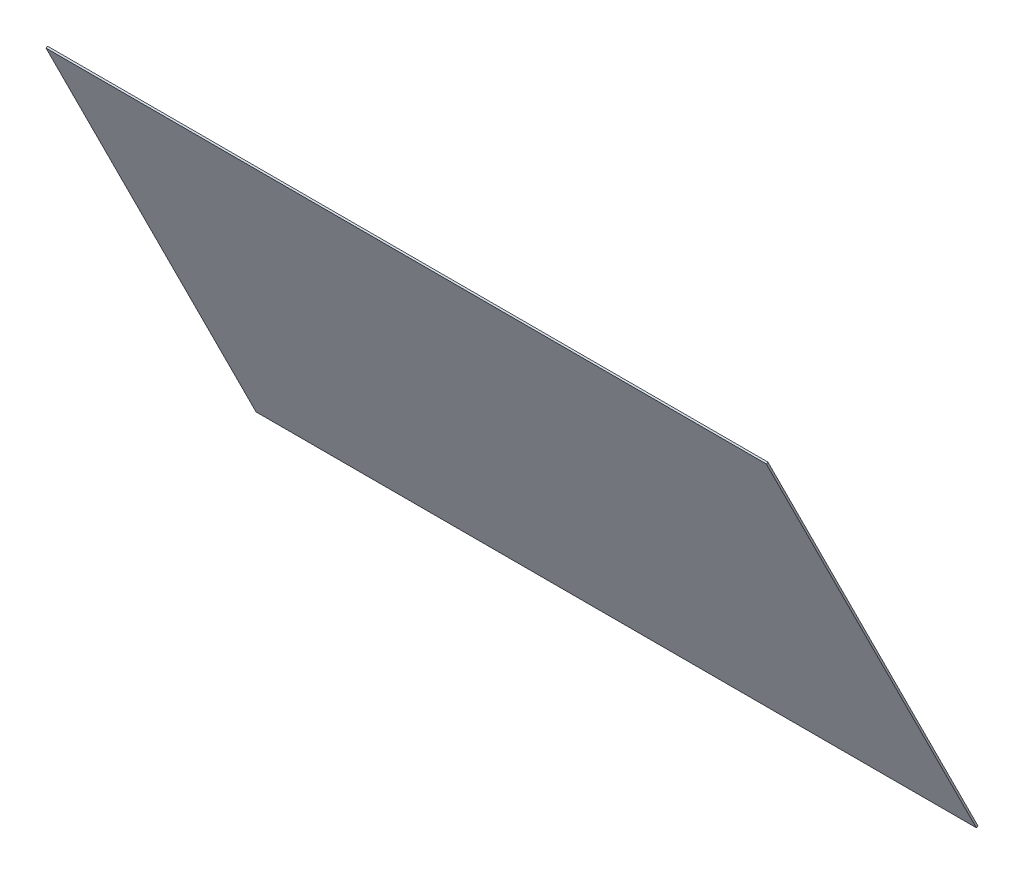
ISO-10303-21;
HEADER;
FILE_DESCRIPTION(('STEP AP214'),'2;1');
FILE_NAME('part.step','',(''),(''),'','','');
FILE_SCHEMA(('AUTOMOTIVE_DESIGN { 1 0 10303 214 1 1 1 1 }'));
ENDSEC;
DATA;
#1=APPLICATION_CONTEXT('core data for automotive mechanical design processes');
#2=APPLICATION_PROTOCOL_DEFINITION('international standard','automotive_design',2000,#1);
#3=PRODUCT_CONTEXT('',#1,'mechanical');
#4=PRODUCT('Part','Part','',(#3));
#5=PRODUCT_RELATED_PRODUCT_CATEGORY('part','',(#4));
#6=PRODUCT_DEFINITION_FORMATION('','',#4);
#7=PRODUCT_DEFINITION_CONTEXT('part definition',#1,'design');
#8=PRODUCT_DEFINITION('design','',#6,#7);
#9=PRODUCT_DEFINITION_SHAPE('','',#8);
#10=(LENGTH_UNIT() NAMED_UNIT(*) SI_UNIT(.MILLI.,.METRE.));
#11=(NAMED_UNIT(*) PLANE_ANGLE_UNIT() SI_UNIT($,.RADIAN.));
#12=(NAMED_UNIT(*) SI_UNIT($,.STERADIAN.) SOLID_ANGLE_UNIT());
#13=UNCERTAINTY_MEASURE_WITH_UNIT(LENGTH_MEASURE(1.E-05),#10,'distance_accuracy_value','');
#14=(GEOMETRIC_REPRESENTATION_CONTEXT(3) GLOBAL_UNCERTAINTY_ASSIGNED_CONTEXT((#13)) GLOBAL_UNIT_ASSIGNED_CONTEXT((#10,
#11,#12)) REPRESENTATION_CONTEXT('',''));
#15=CARTESIAN_POINT('',(0.,0.,0.));
#16=DIRECTION('',(0.,0.,1.));
#17=DIRECTION('',(1.,0.,0.));
#18=AXIS2_PLACEMENT_3D('',#15,#16,#17);
#19=CARTESIAN_POINT('',(-600.,-1.34164078649987,2.68328157299975));
#20=DIRECTION('',(0.,-0.447213595499958,0.894427190999916));
#21=DIRECTION('',(0.,-0.894427190999916,-0.447213595499958));
#22=AXIS2_PLACEMENT_3D('',#19,#20,#21);
#23=PLANE('',#22);
#24=DIRECTION('',(0.,-0.894427190999916,-0.447213595499958));
#25=VECTOR('',#24,1.);
#26=CARTESIAN_POINT('',(600.,-1.34164078649987,2.68328157299975));
#27=LINE('',#26,#25);
#28=CARTESIAN_POINT('',(600.,-1.34164078649987,2.68328157299975));
#29=VERTEX_POINT('',#28);
#30=CARTESIAN_POINT('',(600.,-701.3416407865,-347.316718427));
#31=VERTEX_POINT('',#30);
#32=EDGE_CURVE('E106',#29,#31,#27,.T.);
#33=ORIENTED_EDGE('',*,*,#32,.F.);
#34=DIRECTION('',(1.,0.,0.));
#35=VECTOR('',#34,1.);
#36=CARTESIAN_POINT('',(-600.,-1.34164078649987,2.68328157299975));
#37=LINE('',#36,#35);
#38=CARTESIAN_POINT('',(-600.,-1.34164078649987,2.68328157299975));
#39=VERTEX_POINT('',#38);
#40=EDGE_CURVE('E11',#39,#29,#37,.T.);
#41=ORIENTED_EDGE('',*,*,#40,.F.);
#42=DIRECTION('',(0.,-0.894427190999916,-0.447213595499958));
#43=VECTOR('',#42,1.);
#44=CARTESIAN_POINT('',(-600.,-1.34164078649987,2.68328157299975));
#45=LINE('',#44,#43);
#46=CARTESIAN_POINT('',(-600.,-701.3416407865,-347.316718427));
#47=VERTEX_POINT('',#46);
#48=EDGE_CURVE('E101',#39,#47,#45,.T.);
#49=ORIENTED_EDGE('',*,*,#48,.T.);
#50=DIRECTION('',(1.,0.,0.));
#51=VECTOR('',#50,1.);
#52=CARTESIAN_POINT('',(-600.,-701.3416407865,-347.316718427));
#53=LINE('',#52,#51);
#54=EDGE_CURVE('E44',#47,#31,#53,.T.);
#55=ORIENTED_EDGE('',*,*,#54,.T.);
#56=EDGE_LOOP('',(#33,#41,#49,#55));
#57=FACE_BOUND('',#56,.T.);
#58=ADVANCED_FACE('F41',(#57),#23,.T.);
#59=CARTESIAN_POINT('',(-600.,-1.34164078649987,2.68328157299975));
#60=DIRECTION('',(0.,-0.894427190999916,-0.447213595499958));
#61=DIRECTION('',(0.,0.447213595499958,-0.894427190999916));
#62=AXIS2_PLACEMENT_3D('',#59,#60,#61);
#63=PLANE('',#62);
#64=DIRECTION('',(0.,0.447213595499958,-0.894427190999916));
#65=VECTOR('',#64,1.);
#66=CARTESIAN_POINT('',(600.,-1.34164078649987,2.68328157299975));
#67=LINE('',#66,#65);
#68=CARTESIAN_POINT('',(600.,0.,0.));
#69=VERTEX_POINT('',#68);
#70=EDGE_CURVE('E74',#29,#69,#67,.T.);
#71=ORIENTED_EDGE('',*,*,#70,.T.);
#72=DIRECTION('',(1.,0.,0.));
#73=VECTOR('',#72,1.);
#74=CARTESIAN_POINT('',(-600.,0.,0.));
#75=LINE('',#74,#73);
#76=CARTESIAN_POINT('',(-600.,0.,0.));
#77=VERTEX_POINT('',#76);
#78=EDGE_CURVE('E50',#77,#69,#75,.T.);
#79=ORIENTED_EDGE('',*,*,#78,.F.);
#80=DIRECTION('',(0.,0.447213595499958,-0.894427190999916));
#81=VECTOR('',#80,1.);
#82=CARTESIAN_POINT('',(-600.,-1.34164078649987,2.68328157299975));
#83=LINE('',#82,#81);
#84=EDGE_CURVE('E89',#39,#77,#83,.T.);
#85=ORIENTED_EDGE('',*,*,#84,.F.);
#86=ORIENTED_EDGE('',*,*,#40,.T.);
#87=EDGE_LOOP('',(#71,#79,#85,#86));
#88=FACE_BOUND('',#87,.T.);
#89=ADVANCED_FACE('F116',(#88),#63,.F.);
#90=CARTESIAN_POINT('',(-600.,0.,0.));
#91=DIRECTION('',(0.,-0.447213595499958,0.894427190999916));
#92=DIRECTION('',(0.,-0.894427190999916,-0.447213595499958));
#93=AXIS2_PLACEMENT_3D('',#90,#91,#92);
#94=PLANE('',#93);
#95=DIRECTION('',(0.,-0.894427190999916,-0.447213595499958));
#96=VECTOR('',#95,1.);
#97=CARTESIAN_POINT('',(600.,0.,0.));
#98=LINE('',#97,#96);
#99=CARTESIAN_POINT('',(600.,-700.,-350.));
#100=VERTEX_POINT('',#99);
#101=EDGE_CURVE('E96',#69,#100,#98,.T.);
#102=ORIENTED_EDGE('',*,*,#101,.T.);
#103=DIRECTION('',(1.,0.,0.));
#104=VECTOR('',#103,1.);
#105=CARTESIAN_POINT('',(-600.,-700.,-350.));
#106=LINE('',#105,#104);
#107=CARTESIAN_POINT('',(-600.,-700.,-350.));
#108=VERTEX_POINT('',#107);
#109=EDGE_CURVE('E93',#108,#100,#106,.T.);
#110=ORIENTED_EDGE('',*,*,#109,.F.);
#111=DIRECTION('',(0.,-0.894427190999916,-0.447213595499958));
#112=VECTOR('',#111,1.);
#113=CARTESIAN_POINT('',(-600.,0.,0.));
#114=LINE('',#113,#112);
#115=EDGE_CURVE('E86',#77,#108,#114,.T.);
#116=ORIENTED_EDGE('',*,*,#115,.F.);
#117=ORIENTED_EDGE('',*,*,#78,.T.);
#118=EDGE_LOOP('',(#102,#110,#116,#117));
#119=FACE_BOUND('',#118,.T.);
#120=ADVANCED_FACE('F94',(#119),#94,.F.);
#121=CARTESIAN_POINT('',(-600.,-700.,-350.));
#122=DIRECTION('',(0.,0.894427190999875,0.447213595500039));
#123=DIRECTION('',(0.,-0.447213595500039,0.894427190999875));
#124=AXIS2_PLACEMENT_3D('',#121,#122,#123);
#125=PLANE('',#124);
#126=DIRECTION('',(0.,-0.447213595500039,0.894427190999875));
#127=VECTOR('',#126,1.);
#128=CARTESIAN_POINT('',(600.,-700.,-350.));
#129=LINE('',#128,#127);
#130=EDGE_CURVE('E109',#100,#31,#129,.T.);
#131=ORIENTED_EDGE('',*,*,#130,.T.);
#132=ORIENTED_EDGE('',*,*,#54,.F.);
#133=DIRECTION('',(0.,-0.447213595500039,0.894427190999875));
#134=VECTOR('',#133,1.);
#135=CARTESIAN_POINT('',(-600.,-700.,-350.));
#136=LINE('',#135,#134);
#137=EDGE_CURVE('E83',#108,#47,#136,.T.);
#138=ORIENTED_EDGE('',*,*,#137,.F.);
#139=ORIENTED_EDGE('',*,*,#109,.T.);
#140=EDGE_LOOP('',(#131,#132,#138,#139));
#141=FACE_BOUND('',#140,.T.);
#142=ADVANCED_FACE('F100',(#141),#125,.F.);
#143=CARTESIAN_POINT('',(-600.,0.,0.));
#144=DIRECTION('',(-1.,0.,0.));
#145=DIRECTION('',(0.,0.,1.));
#146=AXIS2_PLACEMENT_3D('',#143,#144,#145);
#147=PLANE('',#146);
#148=ORIENTED_EDGE('',*,*,#48,.F.);
#149=ORIENTED_EDGE('',*,*,#84,.T.);
#150=ORIENTED_EDGE('',*,*,#115,.T.);
#151=ORIENTED_EDGE('',*,*,#137,.T.);
#152=EDGE_LOOP('',(#148,#149,#150,#151));
#153=FACE_BOUND('',#152,.T.);
#154=ADVANCED_FACE('F88',(#153),#147,.T.);
#155=CARTESIAN_POINT('',(600.,0.,0.));
#156=DIRECTION('',(-1.,0.,0.));
#157=DIRECTION('',(0.,0.,1.));
#158=AXIS2_PLACEMENT_3D('',#155,#156,#157);
#159=PLANE('',#158);
#160=ORIENTED_EDGE('',*,*,#32,.T.);
#161=ORIENTED_EDGE('',*,*,#130,.F.);
#162=ORIENTED_EDGE('',*,*,#101,.F.);
#163=ORIENTED_EDGE('',*,*,#70,.F.);
#164=EDGE_LOOP('',(#160,#161,#162,#163));
#165=FACE_BOUND('',#164,.T.);
#166=ADVANCED_FACE('F114',(#165),#159,.F.);
#167=CLOSED_SHELL('',(#58,#89,#120,#142,#154,#166));
#168=MANIFOLD_SOLID_BREP('B2',#167);
#169=ADVANCED_BREP_SHAPE_REPRESENTATION('',(#18,#168),#14);
#170=SHAPE_DEFINITION_REPRESENTATION(#9,#169);
ENDSEC;
END-ISO-10303-21;
